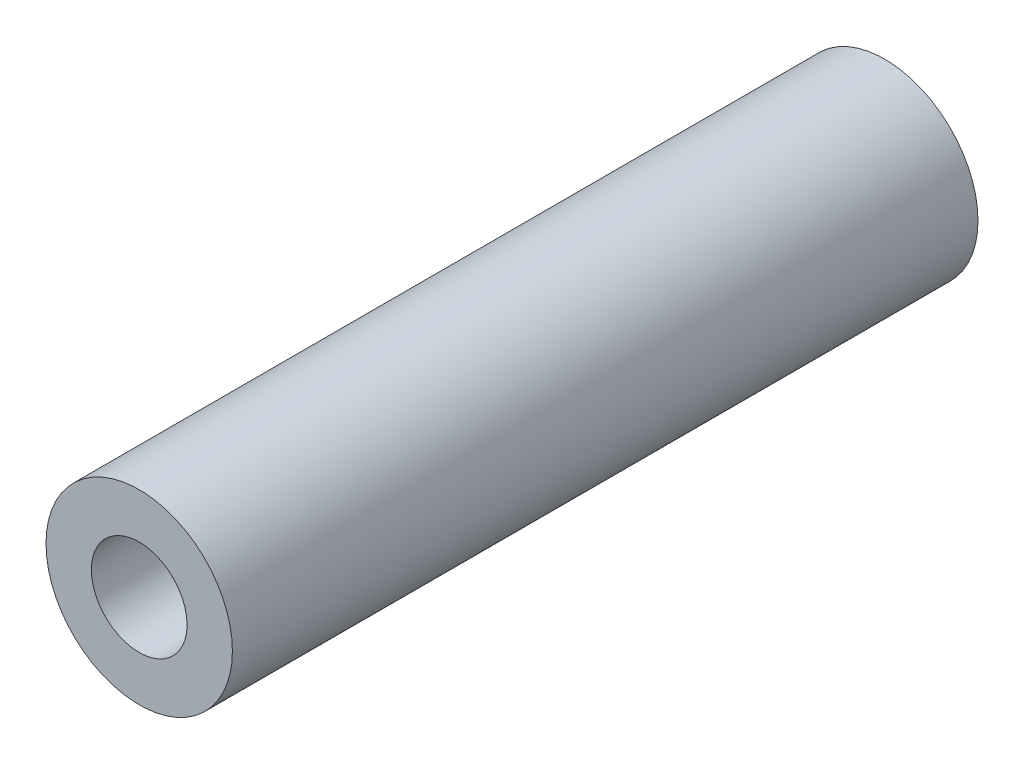
ISO-10303-21;
HEADER;
FILE_DESCRIPTION(('STEP AP214'),'2;1');
FILE_NAME('part.step','',(''),(''),'','','');
FILE_SCHEMA(('AUTOMOTIVE_DESIGN { 1 0 10303 214 1 1 1 1 }'));
ENDSEC;
DATA;
#1=APPLICATION_CONTEXT('core data for automotive mechanical design processes');
#2=APPLICATION_PROTOCOL_DEFINITION('international standard','automotive_design',2000,#1);
#3=PRODUCT_CONTEXT('',#1,'mechanical');
#4=PRODUCT('Part','Part','',(#3));
#5=PRODUCT_RELATED_PRODUCT_CATEGORY('part','',(#4));
#6=PRODUCT_DEFINITION_FORMATION('','',#4);
#7=PRODUCT_DEFINITION_CONTEXT('part definition',#1,'design');
#8=PRODUCT_DEFINITION('design','',#6,#7);
#9=PRODUCT_DEFINITION_SHAPE('','',#8);
#10=(LENGTH_UNIT() NAMED_UNIT(*) SI_UNIT(.MILLI.,.METRE.));
#11=(NAMED_UNIT(*) PLANE_ANGLE_UNIT() SI_UNIT($,.RADIAN.));
#12=(NAMED_UNIT(*) SI_UNIT($,.STERADIAN.) SOLID_ANGLE_UNIT());
#13=UNCERTAINTY_MEASURE_WITH_UNIT(LENGTH_MEASURE(1.E-05),#10,'distance_accuracy_value','');
#14=(GEOMETRIC_REPRESENTATION_CONTEXT(3) GLOBAL_UNCERTAINTY_ASSIGNED_CONTEXT((#13)) GLOBAL_UNIT_ASSIGNED_CONTEXT((#10,
#11,#12)) REPRESENTATION_CONTEXT('',''));
#15=CARTESIAN_POINT('',(0.,0.,0.));
#16=DIRECTION('',(0.,0.,1.));
#17=DIRECTION('',(1.,0.,0.));
#18=AXIS2_PLACEMENT_3D('',#15,#16,#17);
#19=CARTESIAN_POINT('',(0.,0.,38.1));
#20=DIRECTION('',(0.,0.,1.));
#21=DIRECTION('',(1.,0.,0.));
#22=AXIS2_PLACEMENT_3D('',#19,#20,#21);
#23=PLANE('',#22);
#24=CARTESIAN_POINT('',(0.,0.,38.1));
#25=DIRECTION('',(0.,0.,1.));
#26=DIRECTION('',(1.,0.,0.));
#27=AXIS2_PLACEMENT_3D('',#24,#25,#26);
#28=CIRCLE('',#27,9.525);
#29=CARTESIAN_POINT('',(-9.525,0.,38.1));
#30=VERTEX_POINT('',#29);
#31=EDGE_CURVE('E10',#30,#30,#28,.T.);
#32=ORIENTED_EDGE('',*,*,#31,.T.);
#33=EDGE_LOOP('',(#32));
#34=FACE_BOUND('',#33,.T.);
#35=CARTESIAN_POINT('',(0.,0.,38.1));
#36=DIRECTION('',(0.,0.,1.));
#37=DIRECTION('',(1.,0.,0.));
#38=AXIS2_PLACEMENT_3D('',#35,#36,#37);
#39=CIRCLE('',#38,4.8895);
#40=CARTESIAN_POINT('',(-4.8895,0.,38.1));
#41=VERTEX_POINT('',#40);
#42=EDGE_CURVE('E41',#41,#41,#39,.T.);
#43=ORIENTED_EDGE('',*,*,#42,.F.);
#44=EDGE_LOOP('',(#43));
#45=FACE_BOUND('',#44,.T.);
#46=ADVANCED_FACE('F30',(#34,#45),#23,.T.);
#47=CARTESIAN_POINT('',(0.,0.,-38.1));
#48=DIRECTION('',(0.,0.,1.));
#49=DIRECTION('',(1.,0.,0.));
#50=AXIS2_PLACEMENT_3D('',#47,#48,#49);
#51=PLANE('',#50);
#52=CARTESIAN_POINT('',(0.,0.,-38.1));
#53=DIRECTION('',(0.,0.,1.));
#54=DIRECTION('',(1.,0.,0.));
#55=AXIS2_PLACEMENT_3D('',#52,#53,#54);
#56=CIRCLE('',#55,9.525);
#57=CARTESIAN_POINT('',(-9.525,0.,-38.1));
#58=VERTEX_POINT('',#57);
#59=EDGE_CURVE('E34',#58,#58,#56,.T.);
#60=ORIENTED_EDGE('',*,*,#59,.F.);
#61=EDGE_LOOP('',(#60));
#62=FACE_BOUND('',#61,.T.);
#63=CARTESIAN_POINT('',(0.,0.,-38.1));
#64=DIRECTION('',(0.,0.,1.));
#65=DIRECTION('',(1.,0.,0.));
#66=AXIS2_PLACEMENT_3D('',#63,#64,#65);
#67=CIRCLE('',#66,4.8895);
#68=CARTESIAN_POINT('',(-4.8895,0.,-38.1));
#69=VERTEX_POINT('',#68);
#70=EDGE_CURVE('E43',#69,#69,#67,.T.);
#71=ORIENTED_EDGE('',*,*,#70,.T.);
#72=EDGE_LOOP('',(#71));
#73=FACE_BOUND('',#72,.T.);
#74=ADVANCED_FACE('F53',(#62,#73),#51,.F.);
#75=CARTESIAN_POINT('',(0.,0.,38.1));
#76=DIRECTION('',(0.,0.,-1.));
#77=DIRECTION('',(-1.,0.,0.));
#78=AXIS2_PLACEMENT_3D('',#75,#76,#77);
#79=CYLINDRICAL_SURFACE('',#78,9.525);
#80=CARTESIAN_POINT('',(-9.525,0.,38.1));
#81=CARTESIAN_POINT('',(-9.525,0.,37.30625));
#82=CARTESIAN_POINT('',(-9.525,0.,36.5125));
#83=CARTESIAN_POINT('',(-9.525,0.,34.925));
#84=CARTESIAN_POINT('',(-9.525,0.,34.13125));
#85=CARTESIAN_POINT('',(-9.525,0.,32.54375));
#86=CARTESIAN_POINT('',(-9.525,0.,31.75));
#87=CARTESIAN_POINT('',(-9.525,0.,30.1625));
#88=CARTESIAN_POINT('',(-9.525,0.,29.36875));
#89=CARTESIAN_POINT('',(-9.525,0.,27.78125));
#90=CARTESIAN_POINT('',(-9.525,0.,26.9875));
#91=CARTESIAN_POINT('',(-9.525,0.,25.4));
#92=CARTESIAN_POINT('',(-9.525,0.,24.60625));
#93=CARTESIAN_POINT('',(-9.525,0.,23.01875));
#94=CARTESIAN_POINT('',(-9.525,0.,22.225));
#95=CARTESIAN_POINT('',(-9.525,0.,20.6375));
#96=CARTESIAN_POINT('',(-9.525,0.,19.84375));
#97=CARTESIAN_POINT('',(-9.525,0.,18.25625));
#98=CARTESIAN_POINT('',(-9.525,0.,17.4625));
#99=CARTESIAN_POINT('',(-9.525,0.,15.875));
#100=CARTESIAN_POINT('',(-9.525,0.,15.08125));
#101=CARTESIAN_POINT('',(-9.525,0.,13.49375));
#102=CARTESIAN_POINT('',(-9.525,0.,12.7));
#103=CARTESIAN_POINT('',(-9.525,0.,11.1125));
#104=CARTESIAN_POINT('',(-9.525,0.,10.31875));
#105=CARTESIAN_POINT('',(-9.525,0.,8.73124999999999));
#106=CARTESIAN_POINT('',(-9.525,0.,7.93749999999999));
#107=CARTESIAN_POINT('',(-9.525,0.,6.35));
#108=CARTESIAN_POINT('',(-9.525,0.,5.55625));
#109=CARTESIAN_POINT('',(-9.525,0.,3.96875));
#110=CARTESIAN_POINT('',(-9.525,0.,3.175));
#111=CARTESIAN_POINT('',(-9.525,0.,1.5875));
#112=CARTESIAN_POINT('',(-9.525,0.,0.793750000000001));
#113=CARTESIAN_POINT('',(-9.525,0.,-0.793750000000001));
#114=CARTESIAN_POINT('',(-9.525,0.,-1.5875));
#115=CARTESIAN_POINT('',(-9.525,0.,-3.175));
#116=CARTESIAN_POINT('',(-9.525,0.,-3.96875));
#117=CARTESIAN_POINT('',(-9.525,0.,-5.55625));
#118=CARTESIAN_POINT('',(-9.525,0.,-6.35));
#119=CARTESIAN_POINT('',(-9.525,0.,-7.93750000000001));
#120=CARTESIAN_POINT('',(-9.525,0.,-8.73125));
#121=CARTESIAN_POINT('',(-9.525,0.,-10.31875));
#122=CARTESIAN_POINT('',(-9.525,0.,-11.1125));
#123=CARTESIAN_POINT('',(-9.525,0.,-12.7));
#124=CARTESIAN_POINT('',(-9.525,0.,-13.49375));
#125=CARTESIAN_POINT('',(-9.525,0.,-15.08125));
#126=CARTESIAN_POINT('',(-9.525,0.,-15.875));
#127=CARTESIAN_POINT('',(-9.525,0.,-17.4625));
#128=CARTESIAN_POINT('',(-9.525,0.,-18.25625));
#129=CARTESIAN_POINT('',(-9.525,0.,-19.84375));
#130=CARTESIAN_POINT('',(-9.525,0.,-20.6375));
#131=CARTESIAN_POINT('',(-9.525,0.,-22.225));
#132=CARTESIAN_POINT('',(-9.525,0.,-23.01875));
#133=CARTESIAN_POINT('',(-9.525,0.,-24.60625));
#134=CARTESIAN_POINT('',(-9.525,0.,-25.4));
#135=CARTESIAN_POINT('',(-9.525,0.,-26.9875));
#136=CARTESIAN_POINT('',(-9.525,0.,-27.78125));
#137=CARTESIAN_POINT('',(-9.525,0.,-29.36875));
#138=CARTESIAN_POINT('',(-9.525,0.,-30.1625));
#139=CARTESIAN_POINT('',(-9.525,0.,-31.75));
#140=CARTESIAN_POINT('',(-9.525,0.,-32.54375));
#141=CARTESIAN_POINT('',(-9.525,0.,-34.13125));
#142=CARTESIAN_POINT('',(-9.525,0.,-34.925));
#143=CARTESIAN_POINT('',(-9.525,0.,-36.5125));
#144=CARTESIAN_POINT('',(-9.525,0.,-37.30625));
#145=CARTESIAN_POINT('',(-9.525,0.,-38.1));
#146=B_SPLINE_CURVE_WITH_KNOTS('',3,(#80,#81,#82,#83,#84,#85,#86,#87,#88,#89,#90,#91,#92,#93,
#94,#95,#96,#97,#98,#99,#100,#101,#102,#103,#104,#105,#106,#107,#108,#109,#110,#111,#112,#113,
#114,#115,#116,#117,#118,#119,#120,#121,#122,#123,#124,#125,#126,#127,#128,#129,#130,#131,#132,
#133,#134,#135,#136,#137,#138,#139,#140,#141,#142,#143,#144,#145),.UNSPECIFIED.,.F.,.F.,(4,2,2,
2,2,2,2,2,2,2,2,2,2,2,2,2,2,2,2,2,2,2,2,2,2,2,2,2,2,2,2,2,4),(0.,2.38125,4.7625,7.14375,
9.52500000000001,11.90625,14.2875,16.66875,19.05,21.43125,23.8125,26.19375,28.575,30.95625,
33.3375,35.71875,38.1,40.48125,42.8625,45.24375,47.625,50.00625,52.3875,54.76875,57.15,59.53125,
61.9125,64.29375,66.675,69.05625,71.4375,73.81875,76.2),.UNSPECIFIED.);
#147=EDGE_CURVE('BSEAM32',#30,#58,#146,.T.);
#148=ORIENTED_EDGE('',*,*,#31,.F.);
#149=ORIENTED_EDGE('',*,*,#59,.T.);
#150=ORIENTED_EDGE('',*,*,#147,.T.);
#151=ORIENTED_EDGE('',*,*,#147,.F.);
#152=EDGE_LOOP('',(#148,#150,#149,#151));
#153=FACE_BOUND('',#152,.T.);
#154=ADVANCED_FACE('F32',(#153),#79,.T.);
#155=CARTESIAN_POINT('',(0.,0.,38.1));
#156=DIRECTION('',(0.,0.,-1.));
#157=DIRECTION('',(-1.,0.,0.));
#158=AXIS2_PLACEMENT_3D('',#155,#156,#157);
#159=CYLINDRICAL_SURFACE('',#158,4.8895);
#160=CARTESIAN_POINT('',(-4.8895,0.,38.1));
#161=CARTESIAN_POINT('',(-4.8895,0.,37.30625));
#162=CARTESIAN_POINT('',(-4.8895,0.,36.5125));
#163=CARTESIAN_POINT('',(-4.8895,0.,34.925));
#164=CARTESIAN_POINT('',(-4.8895,0.,34.13125));
#165=CARTESIAN_POINT('',(-4.8895,0.,32.54375));
#166=CARTESIAN_POINT('',(-4.8895,0.,31.75));
#167=CARTESIAN_POINT('',(-4.8895,0.,30.1625));
#168=CARTESIAN_POINT('',(-4.8895,0.,29.36875));
#169=CARTESIAN_POINT('',(-4.8895,0.,27.78125));
#170=CARTESIAN_POINT('',(-4.8895,0.,26.9875));
#171=CARTESIAN_POINT('',(-4.8895,0.,25.4));
#172=CARTESIAN_POINT('',(-4.8895,0.,24.60625));
#173=CARTESIAN_POINT('',(-4.8895,0.,23.01875));
#174=CARTESIAN_POINT('',(-4.8895,0.,22.225));
#175=CARTESIAN_POINT('',(-4.8895,0.,20.6375));
#176=CARTESIAN_POINT('',(-4.8895,0.,19.84375));
#177=CARTESIAN_POINT('',(-4.8895,0.,18.25625));
#178=CARTESIAN_POINT('',(-4.8895,0.,17.4625));
#179=CARTESIAN_POINT('',(-4.8895,0.,15.875));
#180=CARTESIAN_POINT('',(-4.8895,0.,15.08125));
#181=CARTESIAN_POINT('',(-4.8895,0.,13.49375));
#182=CARTESIAN_POINT('',(-4.8895,0.,12.7));
#183=CARTESIAN_POINT('',(-4.8895,0.,11.1125));
#184=CARTESIAN_POINT('',(-4.8895,0.,10.31875));
#185=CARTESIAN_POINT('',(-4.8895,0.,8.73124999999999));
#186=CARTESIAN_POINT('',(-4.8895,0.,7.93749999999999));
#187=CARTESIAN_POINT('',(-4.8895,0.,6.34999999999999));
#188=CARTESIAN_POINT('',(-4.8895,0.,5.55625));
#189=CARTESIAN_POINT('',(-4.8895,0.,3.96875));
#190=CARTESIAN_POINT('',(-4.8895,0.,3.17499999999999));
#191=CARTESIAN_POINT('',(-4.8895,0.,1.58749999999999));
#192=CARTESIAN_POINT('',(-4.8895,0.,0.793749999999994));
#193=CARTESIAN_POINT('',(-4.8895,0.,-0.793750000000007));
#194=CARTESIAN_POINT('',(-4.8895,0.,-1.58750000000001));
#195=CARTESIAN_POINT('',(-4.8895,0.,-3.17500000000001));
#196=CARTESIAN_POINT('',(-4.8895,0.,-3.96875000000001));
#197=CARTESIAN_POINT('',(-4.8895,0.,-5.55625000000001));
#198=CARTESIAN_POINT('',(-4.8895,0.,-6.35000000000001));
#199=CARTESIAN_POINT('',(-4.8895,0.,-7.93750000000001));
#200=CARTESIAN_POINT('',(-4.8895,0.,-8.73125000000001));
#201=CARTESIAN_POINT('',(-4.8895,0.,-10.31875));
#202=CARTESIAN_POINT('',(-4.8895,0.,-11.1125));
#203=CARTESIAN_POINT('',(-4.8895,0.,-12.7));
#204=CARTESIAN_POINT('',(-4.8895,0.,-13.49375));
#205=CARTESIAN_POINT('',(-4.8895,0.,-15.08125));
#206=CARTESIAN_POINT('',(-4.8895,0.,-15.875));
#207=CARTESIAN_POINT('',(-4.8895,0.,-17.4625));
#208=CARTESIAN_POINT('',(-4.8895,0.,-18.25625));
#209=CARTESIAN_POINT('',(-4.8895,0.,-19.84375));
#210=CARTESIAN_POINT('',(-4.8895,0.,-20.6375));
#211=CARTESIAN_POINT('',(-4.8895,0.,-22.225));
#212=CARTESIAN_POINT('',(-4.8895,0.,-23.01875));
#213=CARTESIAN_POINT('',(-4.8895,0.,-24.60625));
#214=CARTESIAN_POINT('',(-4.8895,0.,-25.4));
#215=CARTESIAN_POINT('',(-4.8895,0.,-26.9875));
#216=CARTESIAN_POINT('',(-4.8895,0.,-27.78125));
#217=CARTESIAN_POINT('',(-4.8895,0.,-29.36875));
#218=CARTESIAN_POINT('',(-4.8895,0.,-30.1625));
#219=CARTESIAN_POINT('',(-4.8895,0.,-31.75));
#220=CARTESIAN_POINT('',(-4.8895,0.,-32.54375));
#221=CARTESIAN_POINT('',(-4.8895,0.,-34.13125));
#222=CARTESIAN_POINT('',(-4.8895,0.,-34.925));
#223=CARTESIAN_POINT('',(-4.8895,0.,-36.5125));
#224=CARTESIAN_POINT('',(-4.8895,0.,-37.30625));
#225=CARTESIAN_POINT('',(-4.8895,0.,-38.1));
#226=B_SPLINE_CURVE_WITH_KNOTS('',3,(#160,#161,#162,#163,#164,#165,#166,#167,#168,#169,#170,
#171,#172,#173,#174,#175,#176,#177,#178,#179,#180,#181,#182,#183,#184,#185,#186,#187,#188,#189,
#190,#191,#192,#193,#194,#195,#196,#197,#198,#199,#200,#201,#202,#203,#204,#205,#206,#207,#208,
#209,#210,#211,#212,#213,#214,#215,#216,#217,#218,#219,#220,#221,#222,#223,#224,#225),
.UNSPECIFIED.,.F.,.F.,(4,2,2,2,2,2,2,2,2,2,2,2,2,2,2,2,2,2,2,2,2,2,2,2,2,2,2,2,2,2,2,2,4),(0.,
2.38124999999999,4.7625,7.14375,9.525,11.90625,14.2875,16.66875,19.05,21.43125,23.8125,26.19375,
28.575,30.95625,33.3375,35.71875,38.1,40.48125,42.8625,45.24375,47.625,50.00625,52.3875,
54.76875,57.15,59.53125,61.9125,64.29375,66.675,69.05625,71.4375,73.81875,76.2),.UNSPECIFIED.);
#227=EDGE_CURVE('BSEAM49',#41,#69,#226,.T.);
#228=ORIENTED_EDGE('',*,*,#42,.T.);
#229=ORIENTED_EDGE('',*,*,#70,.F.);
#230=ORIENTED_EDGE('',*,*,#227,.T.);
#231=ORIENTED_EDGE('',*,*,#227,.F.);
#232=EDGE_LOOP('',(#228,#230,#229,#231));
#233=FACE_BOUND('',#232,.T.);
#234=ADVANCED_FACE('F49',(#233),#159,.F.);
#235=CLOSED_SHELL('',(#46,#74,#154,#234));
#236=MANIFOLD_SOLID_BREP('B2',#235);
#237=ADVANCED_BREP_SHAPE_REPRESENTATION('',(#18,#236),#14);
#238=SHAPE_DEFINITION_REPRESENTATION(#9,#237);
ENDSEC;
END-ISO-10303-21;
